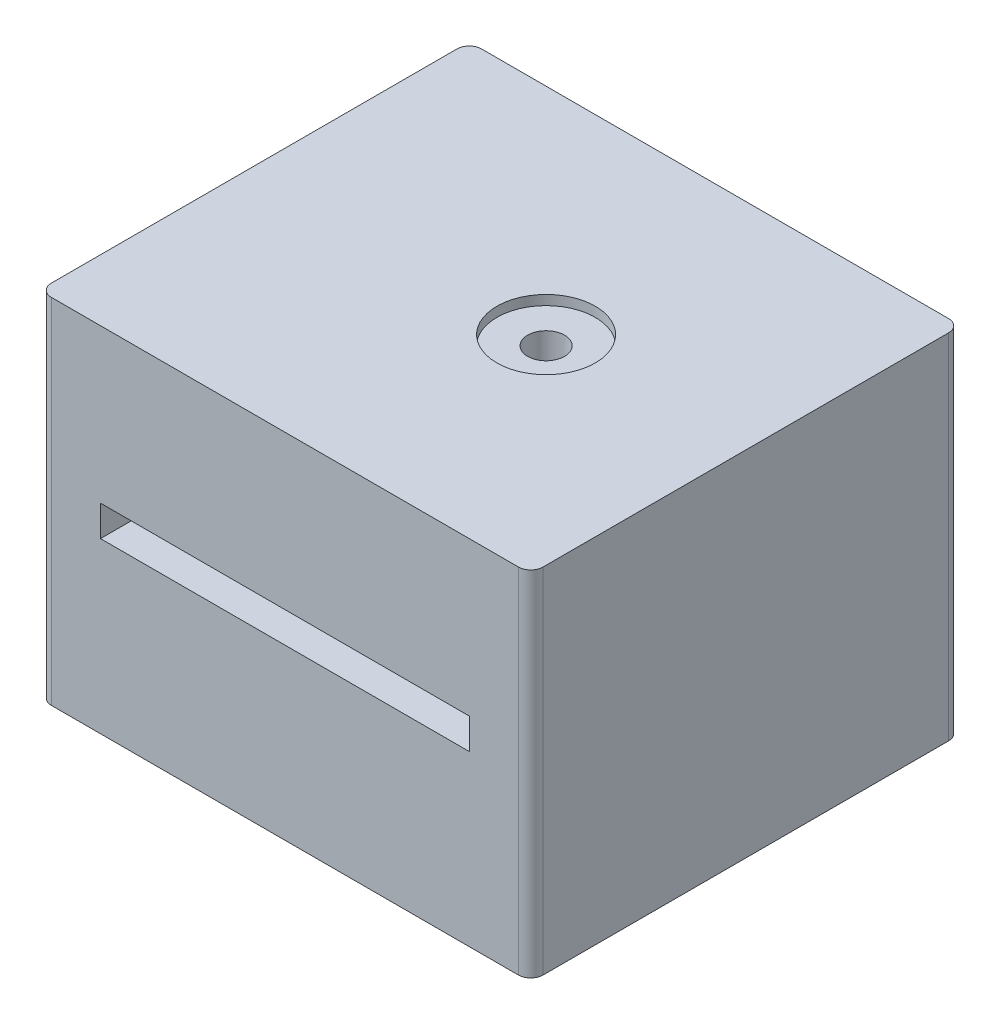
ISO-10303-21;
HEADER;
FILE_DESCRIPTION(('STEP AP214'),'2;1');
FILE_NAME('part.step','',(''),(''),'','','');
FILE_SCHEMA(('AUTOMOTIVE_DESIGN { 1 0 10303 214 1 1 1 1 }'));
ENDSEC;
DATA;
#1=APPLICATION_CONTEXT('core data for automotive mechanical design processes');
#2=APPLICATION_PROTOCOL_DEFINITION('international standard','automotive_design',2000,#1);
#3=PRODUCT_CONTEXT('',#1,'mechanical');
#4=PRODUCT('Part','Part','',(#3));
#5=PRODUCT_RELATED_PRODUCT_CATEGORY('part','',(#4));
#6=PRODUCT_DEFINITION_FORMATION('','',#4);
#7=PRODUCT_DEFINITION_CONTEXT('part definition',#1,'design');
#8=PRODUCT_DEFINITION('design','',#6,#7);
#9=PRODUCT_DEFINITION_SHAPE('','',#8);
#10=(LENGTH_UNIT() NAMED_UNIT(*) SI_UNIT(.MILLI.,.METRE.));
#11=(NAMED_UNIT(*) PLANE_ANGLE_UNIT() SI_UNIT($,.RADIAN.));
#12=(NAMED_UNIT(*) SI_UNIT($,.STERADIAN.) SOLID_ANGLE_UNIT());
#13=UNCERTAINTY_MEASURE_WITH_UNIT(LENGTH_MEASURE(1.E-05),#10,'distance_accuracy_value','');
#14=(GEOMETRIC_REPRESENTATION_CONTEXT(3) GLOBAL_UNCERTAINTY_ASSIGNED_CONTEXT((#13)) GLOBAL_UNIT_ASSIGNED_CONTEXT((#10,
#11,#12)) REPRESENTATION_CONTEXT('',''));
#15=CARTESIAN_POINT('',(0.,0.,0.));
#16=DIRECTION('',(0.,0.,1.));
#17=DIRECTION('',(1.,0.,0.));
#18=AXIS2_PLACEMENT_3D('',#15,#16,#17);
#19=CARTESIAN_POINT('',(-60.,40.,-50.));
#20=DIRECTION('',(-1.,0.,0.));
#21=DIRECTION('',(0.,0.,1.));
#22=AXIS2_PLACEMENT_3D('',#19,#20,#21);
#23=PLANE('',#22);
#24=DIRECTION('',(0.,0.,1.));
#25=VECTOR('',#24,1.);
#26=CARTESIAN_POINT('',(-60.,80.,-50.));
#27=LINE('',#26,#25);
#28=CARTESIAN_POINT('',(-60.,80.,-50.));
#29=VERTEX_POINT('',#28);
#30=CARTESIAN_POINT('',(-60.,80.,50.));
#31=VERTEX_POINT('',#30);
#32=EDGE_CURVE('E653',#29,#31,#27,.T.);
#33=ORIENTED_EDGE('',*,*,#32,.T.);
#34=DIRECTION('',(0.,1.,0.));
#35=VECTOR('',#34,1.);
#36=CARTESIAN_POINT('',(-60.,40.,50.));
#37=LINE('',#36,#35);
#38=CARTESIAN_POINT('',(-60.,50.0000000000001,50.));
#39=VERTEX_POINT('',#38);
#40=EDGE_CURVE('E166',#39,#31,#37,.T.);
#41=ORIENTED_EDGE('',*,*,#40,.F.);
#42=DIRECTION('',(0.,0.,1.));
#43=VECTOR('',#42,1.);
#44=CARTESIAN_POINT('',(-60.,50.0000000000001,50.));
#45=LINE('',#44,#43);
#46=CARTESIAN_POINT('',(-60.,50.0000000000001,70.));
#47=VERTEX_POINT('',#46);
#48=EDGE_CURVE('E152',#39,#47,#45,.T.);
#49=ORIENTED_EDGE('',*,*,#48,.T.);
#50=DIRECTION('',(0.,-1.,0.));
#51=VECTOR('',#50,1.);
#52=CARTESIAN_POINT('',(-60.,50.0000000000001,70.));
#53=LINE('',#52,#51);
#54=CARTESIAN_POINT('',(-60.,40.,70.));
#55=VERTEX_POINT('',#54);
#56=EDGE_CURVE('E628',#47,#55,#53,.T.);
#57=ORIENTED_EDGE('',*,*,#56,.T.);
#58=DIRECTION('',(0.,0.,1.));
#59=VECTOR('',#58,1.);
#60=CARTESIAN_POINT('',(-60.,40.,-50.));
#61=LINE('',#60,#59);
#62=CARTESIAN_POINT('',(-60.,40.,-50.));
#63=VERTEX_POINT('',#62);
#64=EDGE_CURVE('E656',#63,#55,#61,.T.);
#65=ORIENTED_EDGE('',*,*,#64,.F.);
#66=DIRECTION('',(0.,1.,0.));
#67=VECTOR('',#66,1.);
#68=CARTESIAN_POINT('',(-60.,40.,-50.));
#69=LINE('',#68,#67);
#70=EDGE_CURVE('E168',#63,#29,#69,.T.);
#71=ORIENTED_EDGE('',*,*,#70,.T.);
#72=EDGE_LOOP('',(#33,#41,#49,#57,#65,#71));
#73=FACE_BOUND('',#72,.T.);
#74=ADVANCED_FACE('F39',(#73),#23,.F.);
#75=CARTESIAN_POINT('',(-60.,40.,-50.));
#76=DIRECTION('',(0.,0.,-1.));
#77=DIRECTION('',(-1.,0.,0.));
#78=AXIS2_PLACEMENT_3D('',#75,#76,#77);
#79=PLANE('',#78);
#80=DIRECTION('',(-1.,0.,0.));
#81=VECTOR('',#80,1.);
#82=CARTESIAN_POINT('',(-60.,80.,-50.));
#83=LINE('',#82,#81);
#84=CARTESIAN_POINT('',(60.,80.,-50.));
#85=VERTEX_POINT('',#84);
#86=EDGE_CURVE('E659',#85,#29,#83,.T.);
#87=ORIENTED_EDGE('',*,*,#86,.T.);
#88=ORIENTED_EDGE('',*,*,#70,.F.);
#89=DIRECTION('',(-1.,0.,0.));
#90=VECTOR('',#89,1.);
#91=CARTESIAN_POINT('',(-60.,40.,-50.));
#92=LINE('',#91,#90);
#93=CARTESIAN_POINT('',(60.,40.,-50.));
#94=VERTEX_POINT('',#93);
#95=EDGE_CURVE('E170',#94,#63,#92,.T.);
#96=ORIENTED_EDGE('',*,*,#95,.F.);
#97=DIRECTION('',(0.,1.,0.));
#98=VECTOR('',#97,1.);
#99=CARTESIAN_POINT('',(60.,40.,-50.));
#100=LINE('',#99,#98);
#101=EDGE_CURVE('E165',#94,#85,#100,.T.);
#102=ORIENTED_EDGE('',*,*,#101,.T.);
#103=EDGE_LOOP('',(#87,#88,#96,#102));
#104=FACE_BOUND('',#103,.T.);
#105=ADVANCED_FACE('F275',(#104),#79,.F.);
#106=CARTESIAN_POINT('',(60.,40.,-50.));
#107=DIRECTION('',(1.,0.,0.));
#108=DIRECTION('',(0.,0.,-1.));
#109=AXIS2_PLACEMENT_3D('',#106,#107,#108);
#110=PLANE('',#109);
#111=DIRECTION('',(0.,0.,-1.));
#112=VECTOR('',#111,1.);
#113=CARTESIAN_POINT('',(60.,80.,-50.));
#114=LINE('',#113,#112);
#115=CARTESIAN_POINT('',(60.,80.,50.));
#116=VERTEX_POINT('',#115);
#117=EDGE_CURVE('E666',#116,#85,#114,.T.);
#118=ORIENTED_EDGE('',*,*,#117,.T.);
#119=ORIENTED_EDGE('',*,*,#101,.F.);
#120=DIRECTION('',(0.,0.,-1.));
#121=VECTOR('',#120,1.);
#122=CARTESIAN_POINT('',(60.,40.,-50.));
#123=LINE('',#122,#121);
#124=CARTESIAN_POINT('',(60.,40.,70.));
#125=VERTEX_POINT('',#124);
#126=EDGE_CURVE('E658',#125,#94,#123,.T.);
#127=ORIENTED_EDGE('',*,*,#126,.F.);
#128=DIRECTION('',(0.,1.,0.));
#129=VECTOR('',#128,1.);
#130=CARTESIAN_POINT('',(60.,50.,70.));
#131=LINE('',#130,#129);
#132=CARTESIAN_POINT('',(60.,50.,70.));
#133=VERTEX_POINT('',#132);
#134=EDGE_CURVE('E148',#125,#133,#131,.T.);
#135=ORIENTED_EDGE('',*,*,#134,.T.);
#136=DIRECTION('',(0.,0.,1.));
#137=VECTOR('',#136,1.);
#138=CARTESIAN_POINT('',(60.,50.,50.));
#139=LINE('',#138,#137);
#140=CARTESIAN_POINT('',(60.,50.,50.));
#141=VERTEX_POINT('',#140);
#142=EDGE_CURVE('E140',#141,#133,#139,.T.);
#143=ORIENTED_EDGE('',*,*,#142,.F.);
#144=DIRECTION('',(0.,1.,0.));
#145=VECTOR('',#144,1.);
#146=CARTESIAN_POINT('',(60.,40.,50.));
#147=LINE('',#146,#145);
#148=EDGE_CURVE('E145',#141,#116,#147,.T.);
#149=ORIENTED_EDGE('',*,*,#148,.T.);
#150=EDGE_LOOP('',(#118,#119,#127,#135,#143,#149));
#151=FACE_BOUND('',#150,.T.);
#152=ADVANCED_FACE('F143',(#151),#110,.F.);
#153=CARTESIAN_POINT('',(-60.,40.,50.));
#154=DIRECTION('',(0.,0.,1.));
#155=DIRECTION('',(1.,0.,0.));
#156=AXIS2_PLACEMENT_3D('',#153,#154,#155);
#157=PLANE('',#156);
#158=ORIENTED_EDGE('',*,*,#148,.F.);
#159=DIRECTION('',(-1.,0.,0.));
#160=VECTOR('',#159,1.);
#161=CARTESIAN_POINT('',(-60.,50.0000000000001,50.));
#162=LINE('',#161,#160);
#163=EDGE_CURVE('E153',#141,#39,#162,.T.);
#164=ORIENTED_EDGE('',*,*,#163,.T.);
#165=ORIENTED_EDGE('',*,*,#40,.T.);
#166=DIRECTION('',(1.,0.,0.));
#167=VECTOR('',#166,1.);
#168=CARTESIAN_POINT('',(-60.,80.,50.));
#169=LINE('',#168,#167);
#170=EDGE_CURVE('E164',#31,#116,#169,.T.);
#171=ORIENTED_EDGE('',*,*,#170,.T.);
#172=EDGE_LOOP('',(#158,#164,#165,#171));
#173=FACE_BOUND('',#172,.T.);
#174=ADVANCED_FACE('F162',(#173),#157,.F.);
#175=CARTESIAN_POINT('',(0.,40.,0.));
#176=DIRECTION('',(0.,1.,0.));
#177=DIRECTION('',(0.,0.,1.));
#178=AXIS2_PLACEMENT_3D('',#175,#176,#177);
#179=PLANE('',#178);
#180=CARTESIAN_POINT('',(-15.,40.,0.));
#181=DIRECTION('',(0.,1.,0.));
#182=DIRECTION('',(0.,0.,1.));
#183=AXIS2_PLACEMENT_3D('',#180,#181,#182);
#184=CIRCLE('',#183,16.);
#185=CARTESIAN_POINT('',(-15.,40.,16.));
#186=VERTEX_POINT('',#185);
#187=EDGE_CURVE('E642',#186,#186,#184,.T.);
#188=ORIENTED_EDGE('',*,*,#187,.F.);
#189=EDGE_LOOP('',(#188));
#190=FACE_BOUND('',#189,.T.);
#191=CARTESIAN_POINT('',(15.,40.,0.));
#192=DIRECTION('',(0.,1.,0.));
#193=DIRECTION('',(0.,0.,1.));
#194=AXIS2_PLACEMENT_3D('',#191,#192,#193);
#195=CIRCLE('',#194,8.);
#196=CARTESIAN_POINT('',(15.,40.,8.));
#197=VERTEX_POINT('',#196);
#198=EDGE_CURVE('E638',#197,#197,#195,.T.);
#199=ORIENTED_EDGE('',*,*,#198,.F.);
#200=EDGE_LOOP('',(#199));
#201=FACE_BOUND('',#200,.T.);
#202=ORIENTED_EDGE('',*,*,#64,.T.);
#203=DIRECTION('',(1.,0.,0.));
#204=VECTOR('',#203,1.);
#205=CARTESIAN_POINT('',(-60.,40.,70.));
#206=LINE('',#205,#204);
#207=EDGE_CURVE('E633',#55,#125,#206,.T.);
#208=ORIENTED_EDGE('',*,*,#207,.T.);
#209=ORIENTED_EDGE('',*,*,#126,.T.);
#210=ORIENTED_EDGE('',*,*,#95,.T.);
#211=EDGE_LOOP('',(#202,#208,#209,#210));
#212=FACE_BOUND('',#211,.T.);
#213=ADVANCED_FACE('F343',(#190,#201,#212),#179,.T.);
#214=CARTESIAN_POINT('',(0.,80.,0.));
#215=DIRECTION('',(0.,1.,0.));
#216=DIRECTION('',(0.,0.,1.));
#217=AXIS2_PLACEMENT_3D('',#214,#215,#216);
#218=PLANE('',#217);
#219=CARTESIAN_POINT('',(-15.,80.,0.));
#220=DIRECTION('',(0.,1.,0.));
#221=DIRECTION('',(0.,0.,1.));
#222=AXIS2_PLACEMENT_3D('',#219,#220,#221);
#223=CIRCLE('',#222,8.);
#224=CARTESIAN_POINT('',(-15.,80.,8.));
#225=VERTEX_POINT('',#224);
#226=EDGE_CURVE('E613',#225,#225,#223,.T.);
#227=ORIENTED_EDGE('',*,*,#226,.T.);
#228=EDGE_LOOP('',(#227));
#229=FACE_BOUND('',#228,.T.);
#230=CARTESIAN_POINT('',(15.,80.,0.));
#231=DIRECTION('',(0.,1.,0.));
#232=DIRECTION('',(0.,0.,1.));
#233=AXIS2_PLACEMENT_3D('',#230,#231,#232);
#234=CIRCLE('',#233,6.);
#235=CARTESIAN_POINT('',(15.,80.,6.));
#236=VERTEX_POINT('',#235);
#237=EDGE_CURVE('E619',#236,#236,#234,.F.);
#238=ORIENTED_EDGE('',*,*,#237,.F.);
#239=EDGE_LOOP('',(#238));
#240=FACE_BOUND('',#239,.T.);
#241=ORIENTED_EDGE('',*,*,#32,.F.);
#242=ORIENTED_EDGE('',*,*,#86,.F.);
#243=ORIENTED_EDGE('',*,*,#117,.F.);
#244=ORIENTED_EDGE('',*,*,#170,.F.);
#245=EDGE_LOOP('',(#241,#242,#243,#244));
#246=FACE_BOUND('',#245,.T.);
#247=ADVANCED_FACE('F328',(#229,#240,#246),#218,.F.);
#248=CARTESIAN_POINT('',(15.,30.,0.));
#249=DIRECTION('',(0.,1.,0.));
#250=DIRECTION('',(0.,0.,1.));
#251=AXIS2_PLACEMENT_3D('',#248,#249,#250);
#252=PLANE('',#251);
#253=CARTESIAN_POINT('',(15.,30.,0.));
#254=DIRECTION('',(0.,1.,0.));
#255=DIRECTION('',(0.,0.,1.));
#256=AXIS2_PLACEMENT_3D('',#253,#254,#255);
#257=CIRCLE('',#256,8.);
#258=CARTESIAN_POINT('',(15.,30.,8.));
#259=VERTEX_POINT('',#258);
#260=EDGE_CURVE('E645',#259,#259,#257,.T.);
#261=ORIENTED_EDGE('',*,*,#260,.T.);
#262=EDGE_LOOP('',(#261));
#263=FACE_BOUND('',#262,.T.);
#264=CARTESIAN_POINT('',(15.,30.,0.));
#265=DIRECTION('',(0.,1.,0.));
#266=DIRECTION('',(0.,0.,1.));
#267=AXIS2_PLACEMENT_3D('',#264,#265,#266);
#268=CIRCLE('',#267,6.);
#269=CARTESIAN_POINT('',(15.,30.,6.));
#270=VERTEX_POINT('',#269);
#271=EDGE_CURVE('E198',#270,#270,#268,.F.);
#272=ORIENTED_EDGE('',*,*,#271,.T.);
#273=EDGE_LOOP('',(#272));
#274=FACE_BOUND('',#273,.T.);
#275=ADVANCED_FACE('F325',(#263,#274),#252,.T.);
#276=CARTESIAN_POINT('',(15.,30.,0.));
#277=DIRECTION('',(0.,1.,0.));
#278=DIRECTION('',(0.,0.,1.));
#279=AXIS2_PLACEMENT_3D('',#276,#277,#278);
#280=CYLINDRICAL_SURFACE('',#279,8.);
#281=ORIENTED_EDGE('',*,*,#260,.F.);
#282=EDGE_LOOP('',(#281));
#283=FACE_BOUND('',#282,.T.);
#284=ORIENTED_EDGE('',*,*,#198,.T.);
#285=EDGE_LOOP('',(#284));
#286=FACE_BOUND('',#285,.T.);
#287=ADVANCED_FACE('F319',(#283,#286),#280,.F.);
#288=CARTESIAN_POINT('',(-15.,30.,0.));
#289=DIRECTION('',(0.,1.,0.));
#290=DIRECTION('',(0.,0.,1.));
#291=AXIS2_PLACEMENT_3D('',#288,#289,#290);
#292=PLANE('',#291);
#293=CARTESIAN_POINT('',(-15.,30.,0.));
#294=DIRECTION('',(0.,1.,0.));
#295=DIRECTION('',(0.,0.,1.));
#296=AXIS2_PLACEMENT_3D('',#293,#294,#295);
#297=CIRCLE('',#296,16.);
#298=CARTESIAN_POINT('',(-15.,30.,16.));
#299=VERTEX_POINT('',#298);
#300=EDGE_CURVE('E202',#299,#299,#297,.T.);
#301=ORIENTED_EDGE('',*,*,#300,.T.);
#302=EDGE_LOOP('',(#301));
#303=FACE_BOUND('',#302,.T.);
#304=CARTESIAN_POINT('',(-15.,30.,0.));
#305=DIRECTION('',(0.,1.,0.));
#306=DIRECTION('',(0.,0.,1.));
#307=AXIS2_PLACEMENT_3D('',#304,#305,#306);
#308=CIRCLE('',#307,6.);
#309=CARTESIAN_POINT('',(-15.,30.,6.));
#310=VERTEX_POINT('',#309);
#311=EDGE_CURVE('E201',#310,#310,#308,.F.);
#312=ORIENTED_EDGE('',*,*,#311,.T.);
#313=EDGE_LOOP('',(#312));
#314=FACE_BOUND('',#313,.T.);
#315=ADVANCED_FACE('F315',(#303,#314),#292,.T.);
#316=CARTESIAN_POINT('',(-15.,30.,0.));
#317=DIRECTION('',(0.,1.,0.));
#318=DIRECTION('',(0.,0.,1.));
#319=AXIS2_PLACEMENT_3D('',#316,#317,#318);
#320=CYLINDRICAL_SURFACE('',#319,16.);
#321=ORIENTED_EDGE('',*,*,#300,.F.);
#322=EDGE_LOOP('',(#321));
#323=FACE_BOUND('',#322,.T.);
#324=ORIENTED_EDGE('',*,*,#187,.T.);
#325=EDGE_LOOP('',(#324));
#326=FACE_BOUND('',#325,.T.);
#327=ADVANCED_FACE('F318',(#323,#326),#320,.F.);
#328=CARTESIAN_POINT('',(15.,0.,0.));
#329=DIRECTION('',(0.,1.,0.));
#330=DIRECTION('',(0.,0.,1.));
#331=AXIS2_PLACEMENT_3D('',#328,#329,#330);
#332=PLANE('',#331);
#333=CARTESIAN_POINT('',(15.,0.,0.));
#334=DIRECTION('',(0.,1.,0.));
#335=DIRECTION('',(0.,0.,1.));
#336=AXIS2_PLACEMENT_3D('',#333,#334,#335);
#337=CIRCLE('',#336,6.);
#338=CARTESIAN_POINT('',(15.,0.,6.));
#339=VERTEX_POINT('',#338);
#340=EDGE_CURVE('E650',#339,#339,#337,.T.);
#341=ORIENTED_EDGE('',*,*,#340,.T.);
#342=EDGE_LOOP('',(#341));
#343=FACE_BOUND('',#342,.T.);
#344=ADVANCED_FACE('F323',(#343),#332,.T.);
#345=CARTESIAN_POINT('',(15.,0.,0.));
#346=DIRECTION('',(0.,1.,0.));
#347=DIRECTION('',(0.,0.,1.));
#348=AXIS2_PLACEMENT_3D('',#345,#346,#347);
#349=CYLINDRICAL_SURFACE('',#348,6.);
#350=ORIENTED_EDGE('',*,*,#340,.F.);
#351=EDGE_LOOP('',(#350));
#352=FACE_BOUND('',#351,.T.);
#353=ORIENTED_EDGE('',*,*,#271,.F.);
#354=EDGE_LOOP('',(#353));
#355=FACE_BOUND('',#354,.T.);
#356=ADVANCED_FACE('F335',(#352,#355),#349,.F.);
#357=CARTESIAN_POINT('',(-15.,0.,0.));
#358=DIRECTION('',(0.,-1.,0.));
#359=DIRECTION('',(0.,0.,-1.));
#360=AXIS2_PLACEMENT_3D('',#357,#358,#359);
#361=PLANE('',#360);
#362=CARTESIAN_POINT('',(-15.,0.,0.));
#363=DIRECTION('',(0.,1.,0.));
#364=DIRECTION('',(0.,0.,-1.));
#365=AXIS2_PLACEMENT_3D('',#362,#363,#364);
#366=CIRCLE('',#365,6.);
#367=CARTESIAN_POINT('',(-15.,0.,-6.));
#368=VERTEX_POINT('',#367);
#369=EDGE_CURVE('E205',#368,#368,#366,.T.);
#370=ORIENTED_EDGE('',*,*,#369,.T.);
#371=EDGE_LOOP('',(#370));
#372=FACE_BOUND('',#371,.T.);
#373=ADVANCED_FACE('F309',(#372),#361,.F.);
#374=CARTESIAN_POINT('',(-15.,0.,0.));
#375=DIRECTION('',(0.,1.,0.));
#376=DIRECTION('',(0.,0.,1.));
#377=AXIS2_PLACEMENT_3D('',#374,#375,#376);
#378=CYLINDRICAL_SURFACE('',#377,6.);
#379=ORIENTED_EDGE('',*,*,#369,.F.);
#380=EDGE_LOOP('',(#379));
#381=FACE_BOUND('',#380,.T.);
#382=ORIENTED_EDGE('',*,*,#311,.F.);
#383=EDGE_LOOP('',(#382));
#384=FACE_BOUND('',#383,.T.);
#385=ADVANCED_FACE('F304',(#381,#384),#378,.F.);
#386=CARTESIAN_POINT('',(-60.,50.0000000000001,50.));
#387=DIRECTION('',(0.,1.,0.));
#388=DIRECTION('',(-1.,0.,0.));
#389=AXIS2_PLACEMENT_3D('',#386,#387,#388);
#390=PLANE('',#389);
#391=DIRECTION('',(-1.,0.,0.));
#392=VECTOR('',#391,1.);
#393=CARTESIAN_POINT('',(-60.,50.0000000000001,70.));
#394=LINE('',#393,#392);
#395=EDGE_CURVE('E159',#133,#47,#394,.T.);
#396=ORIENTED_EDGE('',*,*,#395,.T.);
#397=ORIENTED_EDGE('',*,*,#48,.F.);
#398=ORIENTED_EDGE('',*,*,#163,.F.);
#399=ORIENTED_EDGE('',*,*,#142,.T.);
#400=EDGE_LOOP('',(#396,#397,#398,#399));
#401=FACE_BOUND('',#400,.T.);
#402=ADVANCED_FACE('F156',(#401),#390,.F.);
#403=CARTESIAN_POINT('',(-80.,-15.,70.));
#404=DIRECTION('',(-1.,0.,0.));
#405=DIRECTION('',(0.,0.,1.));
#406=AXIS2_PLACEMENT_3D('',#403,#404,#405);
#407=PLANE('',#406);
#408=DIRECTION('',(0.,0.,1.));
#409=VECTOR('',#408,1.);
#410=CARTESIAN_POINT('',(-80.,100.,70.));
#411=LINE('',#410,#409);
#412=CARTESIAN_POINT('',(-80.,100.,-66.));
#413=VERTEX_POINT('',#412);
#414=CARTESIAN_POINT('',(-80.,100.,66.));
#415=VERTEX_POINT('',#414);
#416=EDGE_CURVE('E174',#413,#415,#411,.T.);
#417=ORIENTED_EDGE('',*,*,#416,.F.);
#418=DIRECTION('',(0.,1.,0.));
#419=VECTOR('',#418,1.);
#420=CARTESIAN_POINT('',(-80.,-15.,-66.));
#421=LINE('',#420,#419);
#422=CARTESIAN_POINT('',(-80.,-15.,-66.));
#423=VERTEX_POINT('',#422);
#424=EDGE_CURVE('E221',#413,#423,#421,.F.);
#425=ORIENTED_EDGE('',*,*,#424,.T.);
#426=DIRECTION('',(0.,0.,1.));
#427=VECTOR('',#426,1.);
#428=CARTESIAN_POINT('',(-80.,-15.,70.));
#429=LINE('',#428,#427);
#430=CARTESIAN_POINT('',(-80.,-15.,66.));
#431=VERTEX_POINT('',#430);
#432=EDGE_CURVE('E186',#423,#431,#429,.T.);
#433=ORIENTED_EDGE('',*,*,#432,.T.);
#434=DIRECTION('',(0.,1.,0.));
#435=VECTOR('',#434,1.);
#436=CARTESIAN_POINT('',(-80.,-15.,66.));
#437=LINE('',#436,#435);
#438=EDGE_CURVE('E218',#431,#415,#437,.T.);
#439=ORIENTED_EDGE('',*,*,#438,.T.);
#440=EDGE_LOOP('',(#417,#425,#433,#439));
#441=FACE_BOUND('',#440,.T.);
#442=ADVANCED_FACE('F255',(#441),#407,.T.);
#443=CARTESIAN_POINT('',(-80.,-15.,-70.));
#444=DIRECTION('',(0.,0.,-1.));
#445=DIRECTION('',(-1.,0.,0.));
#446=AXIS2_PLACEMENT_3D('',#443,#444,#445);
#447=PLANE('',#446);
#448=DIRECTION('',(-1.,0.,0.));
#449=VECTOR('',#448,1.);
#450=CARTESIAN_POINT('',(-80.,-15.,-70.));
#451=LINE('',#450,#449);
#452=CARTESIAN_POINT('',(76.,-15.,-70.));
#453=VERTEX_POINT('',#452);
#454=CARTESIAN_POINT('',(-76.,-15.,-70.));
#455=VERTEX_POINT('',#454);
#456=EDGE_CURVE('E194',#453,#455,#451,.T.);
#457=ORIENTED_EDGE('',*,*,#456,.T.);
#458=DIRECTION('',(0.,1.,0.));
#459=VECTOR('',#458,1.);
#460=CARTESIAN_POINT('',(-76.,-15.,-70.));
#461=LINE('',#460,#459);
#462=CARTESIAN_POINT('',(-76.,100.,-70.));
#463=VERTEX_POINT('',#462);
#464=EDGE_CURVE('E207',#455,#463,#461,.T.);
#465=ORIENTED_EDGE('',*,*,#464,.T.);
#466=DIRECTION('',(-1.,0.,0.));
#467=VECTOR('',#466,1.);
#468=CARTESIAN_POINT('',(-80.,100.,-70.));
#469=LINE('',#468,#467);
#470=CARTESIAN_POINT('',(76.,100.,-70.));
#471=VERTEX_POINT('',#470);
#472=EDGE_CURVE('E183',#471,#463,#469,.T.);
#473=ORIENTED_EDGE('',*,*,#472,.F.);
#474=DIRECTION('',(0.,1.,0.));
#475=VECTOR('',#474,1.);
#476=CARTESIAN_POINT('',(76.,-15.,-70.));
#477=LINE('',#476,#475);
#478=EDGE_CURVE('E197',#471,#453,#477,.F.);
#479=ORIENTED_EDGE('',*,*,#478,.T.);
#480=EDGE_LOOP('',(#457,#465,#473,#479));
#481=FACE_BOUND('',#480,.T.);
#482=ADVANCED_FACE('F262',(#481),#447,.T.);
#483=CARTESIAN_POINT('',(80.,-15.,70.));
#484=DIRECTION('',(1.,0.,0.));
#485=DIRECTION('',(0.,0.,-1.));
#486=AXIS2_PLACEMENT_3D('',#483,#484,#485);
#487=PLANE('',#486);
#488=DIRECTION('',(0.,0.,-1.));
#489=VECTOR('',#488,1.);
#490=CARTESIAN_POINT('',(80.,-15.,70.));
#491=LINE('',#490,#489);
#492=CARTESIAN_POINT('',(80.,-15.,66.));
#493=VERTEX_POINT('',#492);
#494=CARTESIAN_POINT('',(80.,-15.,-66.));
#495=VERTEX_POINT('',#494);
#496=EDGE_CURVE('E191',#493,#495,#491,.T.);
#497=ORIENTED_EDGE('',*,*,#496,.T.);
#498=DIRECTION('',(0.,1.,0.));
#499=VECTOR('',#498,1.);
#500=CARTESIAN_POINT('',(80.,-15.,-66.));
#501=LINE('',#500,#499);
#502=CARTESIAN_POINT('',(80.,100.,-66.));
#503=VERTEX_POINT('',#502);
#504=EDGE_CURVE('E232',#495,#503,#501,.T.);
#505=ORIENTED_EDGE('',*,*,#504,.T.);
#506=DIRECTION('',(0.,0.,-1.));
#507=VECTOR('',#506,1.);
#508=CARTESIAN_POINT('',(80.,100.,70.));
#509=LINE('',#508,#507);
#510=CARTESIAN_POINT('',(80.,100.,66.));
#511=VERTEX_POINT('',#510);
#512=EDGE_CURVE('E180',#511,#503,#509,.T.);
#513=ORIENTED_EDGE('',*,*,#512,.F.);
#514=DIRECTION('',(0.,1.,0.));
#515=VECTOR('',#514,1.);
#516=CARTESIAN_POINT('',(80.,-15.,66.));
#517=LINE('',#516,#515);
#518=EDGE_CURVE('E230',#511,#493,#517,.F.);
#519=ORIENTED_EDGE('',*,*,#518,.T.);
#520=EDGE_LOOP('',(#497,#505,#513,#519));
#521=FACE_BOUND('',#520,.T.);
#522=ADVANCED_FACE('F237',(#521),#487,.T.);
#523=CARTESIAN_POINT('',(-80.,-15.,70.));
#524=DIRECTION('',(0.,0.,1.));
#525=DIRECTION('',(1.,0.,0.));
#526=AXIS2_PLACEMENT_3D('',#523,#524,#525);
#527=PLANE('',#526);
#528=ORIENTED_EDGE('',*,*,#56,.F.);
#529=ORIENTED_EDGE('',*,*,#395,.F.);
#530=ORIENTED_EDGE('',*,*,#134,.F.);
#531=ORIENTED_EDGE('',*,*,#207,.F.);
#532=EDGE_LOOP('',(#528,#529,#530,#531));
#533=FACE_BOUND('',#532,.T.);
#534=DIRECTION('',(1.,0.,0.));
#535=VECTOR('',#534,1.);
#536=CARTESIAN_POINT('',(-80.,-15.,70.));
#537=LINE('',#536,#535);
#538=CARTESIAN_POINT('',(-76.,-15.,70.));
#539=VERTEX_POINT('',#538);
#540=CARTESIAN_POINT('',(76.,-15.,70.));
#541=VERTEX_POINT('',#540);
#542=EDGE_CURVE('E189',#539,#541,#537,.T.);
#543=ORIENTED_EDGE('',*,*,#542,.T.);
#544=DIRECTION('',(0.,1.,0.));
#545=VECTOR('',#544,1.);
#546=CARTESIAN_POINT('',(76.,-15.,70.));
#547=LINE('',#546,#545);
#548=CARTESIAN_POINT('',(76.,100.,70.));
#549=VERTEX_POINT('',#548);
#550=EDGE_CURVE('E11',#541,#549,#547,.T.);
#551=ORIENTED_EDGE('',*,*,#550,.T.);
#552=DIRECTION('',(1.,0.,0.));
#553=VECTOR('',#552,1.);
#554=CARTESIAN_POINT('',(-80.,100.,70.));
#555=LINE('',#554,#553);
#556=CARTESIAN_POINT('',(-76.,100.,70.));
#557=VERTEX_POINT('',#556);
#558=EDGE_CURVE('E177',#557,#549,#555,.T.);
#559=ORIENTED_EDGE('',*,*,#558,.F.);
#560=DIRECTION('',(0.,1.,0.));
#561=VECTOR('',#560,1.);
#562=CARTESIAN_POINT('',(-76.,-15.,70.));
#563=LINE('',#562,#561);
#564=EDGE_CURVE('E47',#557,#539,#563,.F.);
#565=ORIENTED_EDGE('',*,*,#564,.T.);
#566=EDGE_LOOP('',(#543,#551,#559,#565));
#567=FACE_BOUND('',#566,.T.);
#568=ADVANCED_FACE('F247',(#533,#567),#527,.T.);
#569=CARTESIAN_POINT('',(0.,-15.,0.));
#570=DIRECTION('',(0.,-1.,0.));
#571=DIRECTION('',(0.,0.,-1.));
#572=AXIS2_PLACEMENT_3D('',#569,#570,#571);
#573=PLANE('',#572);
#574=ORIENTED_EDGE('',*,*,#432,.F.);
#575=CARTESIAN_POINT('',(-76.,-15.,-66.));
#576=DIRECTION('',(0.,-1.,0.));
#577=DIRECTION('',(0.,0.,-1.));
#578=AXIS2_PLACEMENT_3D('',#575,#576,#577);
#579=CIRCLE('',#578,4.);
#580=EDGE_CURVE('E228',#423,#455,#579,.T.);
#581=ORIENTED_EDGE('',*,*,#580,.T.);
#582=ORIENTED_EDGE('',*,*,#456,.F.);
#583=CARTESIAN_POINT('',(76.,-15.,-66.));
#584=DIRECTION('',(0.,-1.,0.));
#585=DIRECTION('',(0.,0.,-1.));
#586=AXIS2_PLACEMENT_3D('',#583,#584,#585);
#587=CIRCLE('',#586,4.);
#588=EDGE_CURVE('E226',#453,#495,#587,.T.);
#589=ORIENTED_EDGE('',*,*,#588,.T.);
#590=ORIENTED_EDGE('',*,*,#496,.F.);
#591=CARTESIAN_POINT('',(76.,-15.,66.));
#592=DIRECTION('',(0.,-1.,0.));
#593=DIRECTION('',(0.,0.,-1.));
#594=AXIS2_PLACEMENT_3D('',#591,#592,#593);
#595=CIRCLE('',#594,4.);
#596=EDGE_CURVE('E54',#493,#541,#595,.T.);
#597=ORIENTED_EDGE('',*,*,#596,.T.);
#598=ORIENTED_EDGE('',*,*,#542,.F.);
#599=CARTESIAN_POINT('',(-76.,-15.,66.));
#600=DIRECTION('',(0.,-1.,0.));
#601=DIRECTION('',(0.,0.,-1.));
#602=AXIS2_PLACEMENT_3D('',#599,#600,#601);
#603=CIRCLE('',#602,4.);
#604=EDGE_CURVE('E223',#539,#431,#603,.T.);
#605=ORIENTED_EDGE('',*,*,#604,.T.);
#606=EDGE_LOOP('',(#574,#581,#582,#589,#590,#597,#598,#605));
#607=FACE_BOUND('',#606,.T.);
#608=ADVANCED_FACE('F250',(#607),#573,.T.);
#609=CARTESIAN_POINT('',(0.,100.,0.));
#610=DIRECTION('',(0.,-1.,0.));
#611=DIRECTION('',(0.,0.,-1.));
#612=AXIS2_PLACEMENT_3D('',#609,#610,#611);
#613=PLANE('',#612);
#614=CARTESIAN_POINT('',(15.,100.,0.));
#615=DIRECTION('',(0.,1.,0.));
#616=DIRECTION('',(0.,0.,1.));
#617=AXIS2_PLACEMENT_3D('',#614,#615,#616);
#618=CIRCLE('',#617,16.);
#619=CARTESIAN_POINT('',(15.,100.,16.));
#620=VERTEX_POINT('',#619);
#621=EDGE_CURVE('E622',#620,#620,#618,.T.);
#622=ORIENTED_EDGE('',*,*,#621,.F.);
#623=EDGE_LOOP('',(#622));
#624=FACE_BOUND('',#623,.T.);
#625=ORIENTED_EDGE('',*,*,#472,.T.);
#626=CARTESIAN_POINT('',(-76.,100.,-66.));
#627=DIRECTION('',(0.,-1.,0.));
#628=DIRECTION('',(0.,0.,-1.));
#629=AXIS2_PLACEMENT_3D('',#626,#627,#628);
#630=CIRCLE('',#629,4.);
#631=EDGE_CURVE('E216',#463,#413,#630,.F.);
#632=ORIENTED_EDGE('',*,*,#631,.T.);
#633=ORIENTED_EDGE('',*,*,#416,.T.);
#634=CARTESIAN_POINT('',(-76.,100.,66.));
#635=DIRECTION('',(0.,-1.,0.));
#636=DIRECTION('',(0.,0.,-1.));
#637=AXIS2_PLACEMENT_3D('',#634,#635,#636);
#638=CIRCLE('',#637,4.);
#639=EDGE_CURVE('E210',#415,#557,#638,.F.);
#640=ORIENTED_EDGE('',*,*,#639,.T.);
#641=ORIENTED_EDGE('',*,*,#558,.T.);
#642=CARTESIAN_POINT('',(76.,100.,66.));
#643=DIRECTION('',(0.,-1.,0.));
#644=DIRECTION('',(0.,0.,-1.));
#645=AXIS2_PLACEMENT_3D('',#642,#643,#644);
#646=CIRCLE('',#645,4.);
#647=EDGE_CURVE('E212',#549,#511,#646,.F.);
#648=ORIENTED_EDGE('',*,*,#647,.T.);
#649=ORIENTED_EDGE('',*,*,#512,.T.);
#650=CARTESIAN_POINT('',(76.,100.,-66.));
#651=DIRECTION('',(0.,-1.,0.));
#652=DIRECTION('',(0.,0.,-1.));
#653=AXIS2_PLACEMENT_3D('',#650,#651,#652);
#654=CIRCLE('',#653,4.);
#655=EDGE_CURVE('E214',#503,#471,#654,.F.);
#656=ORIENTED_EDGE('',*,*,#655,.T.);
#657=EDGE_LOOP('',(#625,#632,#633,#640,#641,#648,#649,#656));
#658=FACE_BOUND('',#657,.T.);
#659=ADVANCED_FACE('F242',(#624,#658),#613,.F.);
#660=CARTESIAN_POINT('',(15.,96.85,0.));
#661=DIRECTION('',(0.,1.,0.));
#662=DIRECTION('',(0.,0.,1.));
#663=AXIS2_PLACEMENT_3D('',#660,#661,#662);
#664=CYLINDRICAL_SURFACE('',#663,16.);
#665=CARTESIAN_POINT('',(15.,96.85,0.));
#666=DIRECTION('',(0.,1.,0.));
#667=DIRECTION('',(0.,0.,1.));
#668=AXIS2_PLACEMENT_3D('',#665,#666,#667);
#669=CIRCLE('',#668,16.);
#670=CARTESIAN_POINT('',(15.,96.85,16.));
#671=VERTEX_POINT('',#670);
#672=EDGE_CURVE('E625',#671,#671,#669,.T.);
#673=ORIENTED_EDGE('',*,*,#672,.F.);
#674=EDGE_LOOP('',(#673));
#675=FACE_BOUND('',#674,.T.);
#676=ORIENTED_EDGE('',*,*,#621,.T.);
#677=EDGE_LOOP('',(#676));
#678=FACE_BOUND('',#677,.T.);
#679=ADVANCED_FACE('F289',(#675,#678),#664,.F.);
#680=CARTESIAN_POINT('',(15.,96.85,0.));
#681=DIRECTION('',(0.,1.,0.));
#682=DIRECTION('',(0.,0.,1.));
#683=AXIS2_PLACEMENT_3D('',#680,#681,#682);
#684=PLANE('',#683);
#685=CARTESIAN_POINT('',(15.,96.85,0.));
#686=DIRECTION('',(0.,1.,0.));
#687=DIRECTION('',(0.,0.,1.));
#688=AXIS2_PLACEMENT_3D('',#685,#686,#687);
#689=CIRCLE('',#688,6.);
#690=CARTESIAN_POINT('',(15.,96.85,6.));
#691=VERTEX_POINT('',#690);
#692=EDGE_CURVE('E616',#691,#691,#689,.T.);
#693=ORIENTED_EDGE('',*,*,#692,.F.);
#694=EDGE_LOOP('',(#693));
#695=FACE_BOUND('',#694,.T.);
#696=ORIENTED_EDGE('',*,*,#672,.T.);
#697=EDGE_LOOP('',(#696));
#698=FACE_BOUND('',#697,.T.);
#699=ADVANCED_FACE('F437',(#695,#698),#684,.T.);
#700=CARTESIAN_POINT('',(15.,-15.001,0.));
#701=DIRECTION('',(0.,1.,0.));
#702=DIRECTION('',(0.,0.,1.));
#703=AXIS2_PLACEMENT_3D('',#700,#701,#702);
#704=CYLINDRICAL_SURFACE('',#703,6.);
#705=CARTESIAN_POINT('',(15.,96.85,6.));
#706=CARTESIAN_POINT('',(15.,96.6744791666667,6.));
#707=CARTESIAN_POINT('',(15.,96.4989583333333,6.));
#708=CARTESIAN_POINT('',(15.,96.1479166666667,6.));
#709=CARTESIAN_POINT('',(15.,95.9723958333333,6.));
#710=CARTESIAN_POINT('',(15.,95.6213541666667,6.));
#711=CARTESIAN_POINT('',(15.,95.4458333333333,6.));
#712=CARTESIAN_POINT('',(15.,95.0947916666667,6.));
#713=CARTESIAN_POINT('',(15.,94.9192708333333,6.));
#714=CARTESIAN_POINT('',(15.,94.5682291666667,6.));
#715=CARTESIAN_POINT('',(15.,94.3927083333333,6.));
#716=CARTESIAN_POINT('',(15.,94.0416666666667,6.));
#717=CARTESIAN_POINT('',(15.,93.8661458333333,6.));
#718=CARTESIAN_POINT('',(15.,93.5151041666667,6.));
#719=CARTESIAN_POINT('',(15.,93.3395833333333,6.));
#720=CARTESIAN_POINT('',(15.,92.9885416666667,6.));
#721=CARTESIAN_POINT('',(15.,92.8130208333333,6.));
#722=CARTESIAN_POINT('',(15.,92.4619791666667,6.));
#723=CARTESIAN_POINT('',(15.,92.2864583333333,6.));
#724=CARTESIAN_POINT('',(15.,91.9354166666667,6.));
#725=CARTESIAN_POINT('',(15.,91.7598958333333,6.));
#726=CARTESIAN_POINT('',(15.,91.4088541666667,6.));
#727=CARTESIAN_POINT('',(15.,91.2333333333333,6.));
#728=CARTESIAN_POINT('',(15.,90.8822916666667,6.));
#729=CARTESIAN_POINT('',(15.,90.7067708333333,6.));
#730=CARTESIAN_POINT('',(15.,90.3557291666667,6.));
#731=CARTESIAN_POINT('',(15.,90.1802083333333,6.));
#732=CARTESIAN_POINT('',(15.,89.8291666666667,6.));
#733=CARTESIAN_POINT('',(15.,89.6536458333333,6.));
#734=CARTESIAN_POINT('',(15.,89.3026041666667,6.));
#735=CARTESIAN_POINT('',(15.,89.1270833333333,6.));
#736=CARTESIAN_POINT('',(15.,88.7760416666667,6.));
#737=CARTESIAN_POINT('',(15.,88.6005208333333,6.));
#738=CARTESIAN_POINT('',(15.,88.2494791666667,6.));
#739=CARTESIAN_POINT('',(15.,88.0739583333333,6.));
#740=CARTESIAN_POINT('',(15.,87.7229166666666,6.));
#741=CARTESIAN_POINT('',(15.,87.5473958333333,6.));
#742=CARTESIAN_POINT('',(15.,87.1963541666667,6.));
#743=CARTESIAN_POINT('',(15.,87.0208333333333,6.));
#744=CARTESIAN_POINT('',(15.,86.6697916666667,6.));
#745=CARTESIAN_POINT('',(15.,86.4942708333333,6.));
#746=CARTESIAN_POINT('',(15.,86.1432291666667,6.));
#747=CARTESIAN_POINT('',(15.,85.9677083333333,6.));
#748=CARTESIAN_POINT('',(15.,85.6166666666667,6.));
#749=CARTESIAN_POINT('',(15.,85.4411458333333,6.));
#750=CARTESIAN_POINT('',(15.,85.0901041666666,6.));
#751=CARTESIAN_POINT('',(15.,84.9145833333333,6.));
#752=CARTESIAN_POINT('',(15.,84.5635416666667,6.));
#753=CARTESIAN_POINT('',(15.,84.3880208333333,6.));
#754=CARTESIAN_POINT('',(15.,84.0369791666667,6.));
#755=CARTESIAN_POINT('',(15.,83.8614583333333,6.));
#756=CARTESIAN_POINT('',(15.,83.5104166666667,6.));
#757=CARTESIAN_POINT('',(15.,83.3348958333333,6.));
#758=CARTESIAN_POINT('',(15.,82.9838541666667,6.));
#759=CARTESIAN_POINT('',(15.,82.8083333333333,6.));
#760=CARTESIAN_POINT('',(15.,82.4572916666666,6.));
#761=CARTESIAN_POINT('',(15.,82.2817708333333,6.));
#762=CARTESIAN_POINT('',(15.,81.9307291666667,6.));
#763=CARTESIAN_POINT('',(15.,81.7552083333333,6.));
#764=CARTESIAN_POINT('',(15.,81.4041666666667,6.));
#765=CARTESIAN_POINT('',(15.,81.2286458333333,6.));
#766=CARTESIAN_POINT('',(15.,80.8776041666667,6.));
#767=CARTESIAN_POINT('',(15.,80.7020833333333,6.));
#768=CARTESIAN_POINT('',(15.,80.3510416666666,6.));
#769=CARTESIAN_POINT('',(15.,80.1755208333333,6.));
#770=CARTESIAN_POINT('',(15.,80.,6.));
#771=B_SPLINE_CURVE_WITH_KNOTS('',3,(#705,#706,#707,#708,#709,#710,#711,#712,#713,#714,#715,
#716,#717,#718,#719,#720,#721,#722,#723,#724,#725,#726,#727,#728,#729,#730,#731,#732,#733,#734,
#735,#736,#737,#738,#739,#740,#741,#742,#743,#744,#745,#746,#747,#748,#749,#750,#751,#752,#753,
#754,#755,#756,#757,#758,#759,#760,#761,#762,#763,#764,#765,#766,#767,#768,#769,#770),
.UNSPECIFIED.,.F.,.F.,(4,2,2,2,2,2,2,2,2,2,2,2,2,2,2,2,2,2,2,2,2,2,2,2,2,2,2,2,2,2,2,2,4),(0.,
0.526562499999994,1.053125,1.5796875,2.10625,2.6328125,3.15937500000001,3.6859375,
4.21250000000001,4.7390625,5.265625,5.7921875,6.31875,6.84531250000001,7.371875,
7.89843749999999,8.425,8.95156250000001,9.478125,10.0046875,10.53125,11.0578125,11.584375,
12.1109375,12.6375,13.1640625,13.690625,14.2171875,14.74375,15.2703125,15.796875,16.3234375,
16.85),.UNSPECIFIED.);
#772=EDGE_CURVE('BSEAM447',#691,#236,#771,.T.);
#773=ORIENTED_EDGE('',*,*,#692,.T.);
#774=ORIENTED_EDGE('',*,*,#237,.T.);
#775=ORIENTED_EDGE('',*,*,#772,.T.);
#776=ORIENTED_EDGE('',*,*,#772,.F.);
#777=EDGE_LOOP('',(#773,#775,#774,#776));
#778=FACE_BOUND('',#777,.T.);
#779=ADVANCED_FACE('F447',(#778),#704,.F.);
#780=CARTESIAN_POINT('',(-15.,80.,0.));
#781=DIRECTION('',(0.,1.,0.));
#782=DIRECTION('',(0.,0.,1.));
#783=AXIS2_PLACEMENT_3D('',#780,#781,#782);
#784=CYLINDRICAL_SURFACE('',#783,8.);
#785=ORIENTED_EDGE('',*,*,#226,.F.);
#786=EDGE_LOOP('',(#785));
#787=FACE_BOUND('',#786,.T.);
#788=CARTESIAN_POINT('',(-15.,90.,0.));
#789=DIRECTION('',(0.,1.,0.));
#790=DIRECTION('',(0.,0.,1.));
#791=AXIS2_PLACEMENT_3D('',#788,#789,#790);
#792=CIRCLE('',#791,8.);
#793=CARTESIAN_POINT('',(-15.,90.,8.));
#794=VERTEX_POINT('',#793);
#795=EDGE_CURVE('E611',#794,#794,#792,.T.);
#796=ORIENTED_EDGE('',*,*,#795,.T.);
#797=EDGE_LOOP('',(#796));
#798=FACE_BOUND('',#797,.T.);
#799=ADVANCED_FACE('F456',(#787,#798),#784,.F.);
#800=CARTESIAN_POINT('',(-15.,90.,0.));
#801=DIRECTION('',(0.,1.,0.));
#802=DIRECTION('',(0.,0.,1.));
#803=AXIS2_PLACEMENT_3D('',#800,#801,#802);
#804=PLANE('',#803);
#805=ORIENTED_EDGE('',*,*,#795,.F.);
#806=EDGE_LOOP('',(#805));
#807=FACE_BOUND('',#806,.T.);
#808=ADVANCED_FACE('F272',(#807),#804,.F.);
#809=CARTESIAN_POINT('',(-76.,-15.,-66.));
#810=DIRECTION('',(0.,1.,0.));
#811=DIRECTION('',(0.,0.,1.));
#812=AXIS2_PLACEMENT_3D('',#809,#810,#811);
#813=CYLINDRICAL_SURFACE('',#812,4.);
#814=ORIENTED_EDGE('',*,*,#580,.F.);
#815=ORIENTED_EDGE('',*,*,#424,.F.);
#816=ORIENTED_EDGE('',*,*,#631,.F.);
#817=ORIENTED_EDGE('',*,*,#464,.F.);
#818=EDGE_LOOP('',(#814,#815,#816,#817));
#819=FACE_BOUND('',#818,.T.);
#820=ADVANCED_FACE('F260',(#819),#813,.T.);
#821=CARTESIAN_POINT('',(76.,-15.,-66.));
#822=DIRECTION('',(0.,1.,0.));
#823=DIRECTION('',(0.,0.,1.));
#824=AXIS2_PLACEMENT_3D('',#821,#822,#823);
#825=CYLINDRICAL_SURFACE('',#824,4.);
#826=ORIENTED_EDGE('',*,*,#588,.F.);
#827=ORIENTED_EDGE('',*,*,#478,.F.);
#828=ORIENTED_EDGE('',*,*,#655,.F.);
#829=ORIENTED_EDGE('',*,*,#504,.F.);
#830=EDGE_LOOP('',(#826,#827,#828,#829));
#831=FACE_BOUND('',#830,.T.);
#832=ADVANCED_FACE('F265',(#831),#825,.T.);
#833=CARTESIAN_POINT('',(76.,-15.,66.));
#834=DIRECTION('',(0.,1.,0.));
#835=DIRECTION('',(0.,0.,1.));
#836=AXIS2_PLACEMENT_3D('',#833,#834,#835);
#837=CYLINDRICAL_SURFACE('',#836,4.);
#838=ORIENTED_EDGE('',*,*,#596,.F.);
#839=ORIENTED_EDGE('',*,*,#518,.F.);
#840=ORIENTED_EDGE('',*,*,#647,.F.);
#841=ORIENTED_EDGE('',*,*,#550,.F.);
#842=EDGE_LOOP('',(#838,#839,#840,#841));
#843=FACE_BOUND('',#842,.T.);
#844=ADVANCED_FACE('F246',(#843),#837,.T.);
#845=CARTESIAN_POINT('',(-76.,-15.,66.));
#846=DIRECTION('',(0.,1.,0.));
#847=DIRECTION('',(0.,0.,1.));
#848=AXIS2_PLACEMENT_3D('',#845,#846,#847);
#849=CYLINDRICAL_SURFACE('',#848,4.);
#850=ORIENTED_EDGE('',*,*,#604,.F.);
#851=ORIENTED_EDGE('',*,*,#564,.F.);
#852=ORIENTED_EDGE('',*,*,#639,.F.);
#853=ORIENTED_EDGE('',*,*,#438,.F.);
#854=EDGE_LOOP('',(#850,#851,#852,#853));
#855=FACE_BOUND('',#854,.T.);
#856=ADVANCED_FACE('F41',(#855),#849,.T.);
#857=CLOSED_SHELL('',(#74,#105,#152,#174,#213,#247,#275,#287,#315,#327,#344,#356,#373,#385,#402,
#442,#482,#522,#568,#608,#659,#679,#699,#779,#799,#808,#820,#832,#844,#856));
#858=MANIFOLD_SOLID_BREP('B2',#857);
#859=ADVANCED_BREP_SHAPE_REPRESENTATION('',(#18,#858),#14);
#860=SHAPE_DEFINITION_REPRESENTATION(#9,#859);
ENDSEC;
END-ISO-10303-21;
